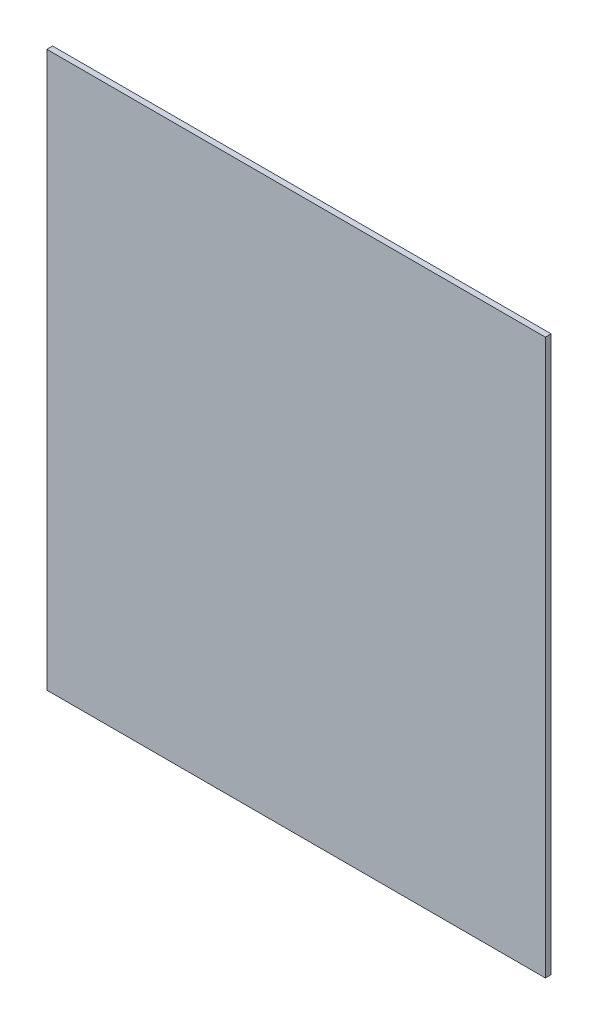
ISO-10303-21;
HEADER;
FILE_DESCRIPTION(('STEP AP214'),'2;1');
FILE_NAME('part.step','',(''),(''),'','','');
FILE_SCHEMA(('AUTOMOTIVE_DESIGN { 1 0 10303 214 1 1 1 1 }'));
ENDSEC;
DATA;
#1=APPLICATION_CONTEXT('core data for automotive mechanical design processes');
#2=APPLICATION_PROTOCOL_DEFINITION('international standard','automotive_design',2000,#1);
#3=PRODUCT_CONTEXT('',#1,'mechanical');
#4=PRODUCT('Part','Part','',(#3));
#5=PRODUCT_RELATED_PRODUCT_CATEGORY('part','',(#4));
#6=PRODUCT_DEFINITION_FORMATION('','',#4);
#7=PRODUCT_DEFINITION_CONTEXT('part definition',#1,'design');
#8=PRODUCT_DEFINITION('design','',#6,#7);
#9=PRODUCT_DEFINITION_SHAPE('','',#8);
#10=(LENGTH_UNIT() NAMED_UNIT(*) SI_UNIT(.MILLI.,.METRE.));
#11=(NAMED_UNIT(*) PLANE_ANGLE_UNIT() SI_UNIT($,.RADIAN.));
#12=(NAMED_UNIT(*) SI_UNIT($,.STERADIAN.) SOLID_ANGLE_UNIT());
#13=UNCERTAINTY_MEASURE_WITH_UNIT(LENGTH_MEASURE(1.E-05),#10,'distance_accuracy_value','');
#14=(GEOMETRIC_REPRESENTATION_CONTEXT(3) GLOBAL_UNCERTAINTY_ASSIGNED_CONTEXT((#13)) GLOBAL_UNIT_ASSIGNED_CONTEXT((#10,
#11,#12)) REPRESENTATION_CONTEXT('',''));
#15=CARTESIAN_POINT('',(0.,0.,0.));
#16=DIRECTION('',(0.,0.,1.));
#17=DIRECTION('',(1.,0.,0.));
#18=AXIS2_PLACEMENT_3D('',#15,#16,#17);
#19=CARTESIAN_POINT('',(-116.392992274228,109.571624087591,3.));
#20=DIRECTION('',(1.,0.,0.));
#21=DIRECTION('',(0.,1.,0.));
#22=AXIS2_PLACEMENT_3D('',#19,#20,#21);
#23=PLANE('',#22);
#24=DIRECTION('',(0.,-1.,0.));
#25=VECTOR('',#24,1.);
#26=CARTESIAN_POINT('',(-116.392992274228,109.571624087591,0.));
#27=LINE('',#26,#25);
#28=CARTESIAN_POINT('',(-116.392992274228,109.571624087591,0.));
#29=VERTEX_POINT('',#28);
#30=CARTESIAN_POINT('',(-116.392992274228,-180.428375912409,0.));
#31=VERTEX_POINT('',#30);
#32=EDGE_CURVE('E98',#29,#31,#27,.T.);
#33=ORIENTED_EDGE('',*,*,#32,.T.);
#34=DIRECTION('',(0.,0.,-1.));
#35=VECTOR('',#34,1.);
#36=CARTESIAN_POINT('',(-116.392992274228,-180.428375912409,3.));
#37=LINE('',#36,#35);
#38=CARTESIAN_POINT('',(-116.392992274228,-180.428375912409,3.));
#39=VERTEX_POINT('',#38);
#40=EDGE_CURVE('E11',#39,#31,#37,.T.);
#41=ORIENTED_EDGE('',*,*,#40,.F.);
#42=DIRECTION('',(0.,-1.,0.));
#43=VECTOR('',#42,1.);
#44=CARTESIAN_POINT('',(-116.392992274228,109.571624087591,3.));
#45=LINE('',#44,#43);
#46=CARTESIAN_POINT('',(-116.392992274228,109.571624087591,3.));
#47=VERTEX_POINT('',#46);
#48=EDGE_CURVE('E86',#47,#39,#45,.T.);
#49=ORIENTED_EDGE('',*,*,#48,.F.);
#50=DIRECTION('',(0.,0.,-1.));
#51=VECTOR('',#50,1.);
#52=CARTESIAN_POINT('',(-116.392992274228,109.571624087591,3.));
#53=LINE('',#52,#51);
#54=EDGE_CURVE('E94',#47,#29,#53,.T.);
#55=ORIENTED_EDGE('',*,*,#54,.T.);
#56=EDGE_LOOP('',(#33,#41,#49,#55));
#57=FACE_BOUND('',#56,.T.);
#58=ADVANCED_FACE('F35',(#57),#23,.F.);
#59=CARTESIAN_POINT('',(-116.392992274228,-180.428375912409,3.));
#60=DIRECTION('',(0.,1.,0.));
#61=DIRECTION('',(0.,0.,1.));
#62=AXIS2_PLACEMENT_3D('',#59,#60,#61);
#63=PLANE('',#62);
#64=DIRECTION('',(1.,0.,0.));
#65=VECTOR('',#64,1.);
#66=CARTESIAN_POINT('',(-116.392992274228,-180.428375912409,0.));
#67=LINE('',#66,#65);
#68=CARTESIAN_POINT('',(144.107007725772,-180.428375912409,0.));
#69=VERTEX_POINT('',#68);
#70=EDGE_CURVE('E90',#31,#69,#67,.T.);
#71=ORIENTED_EDGE('',*,*,#70,.T.);
#72=DIRECTION('',(0.,0.,-1.));
#73=VECTOR('',#72,1.);
#74=CARTESIAN_POINT('',(144.107007725772,-180.428375912409,3.));
#75=LINE('',#74,#73);
#76=CARTESIAN_POINT('',(144.107007725772,-180.428375912409,3.));
#77=VERTEX_POINT('',#76);
#78=EDGE_CURVE('E43',#77,#69,#75,.T.);
#79=ORIENTED_EDGE('',*,*,#78,.F.);
#80=DIRECTION('',(1.,0.,0.));
#81=VECTOR('',#80,1.);
#82=CARTESIAN_POINT('',(-116.392992274228,-180.428375912409,3.));
#83=LINE('',#82,#81);
#84=EDGE_CURVE('E81',#39,#77,#83,.T.);
#85=ORIENTED_EDGE('',*,*,#84,.F.);
#86=ORIENTED_EDGE('',*,*,#40,.T.);
#87=EDGE_LOOP('',(#71,#79,#85,#86));
#88=FACE_BOUND('',#87,.T.);
#89=ADVANCED_FACE('F89',(#88),#63,.F.);
#90=CARTESIAN_POINT('',(144.107007725772,109.571624087591,3.));
#91=DIRECTION('',(-1.,0.,0.));
#92=DIRECTION('',(0.,-1.,0.));
#93=AXIS2_PLACEMENT_3D('',#90,#91,#92);
#94=PLANE('',#93);
#95=DIRECTION('',(0.,1.,0.));
#96=VECTOR('',#95,1.);
#97=CARTESIAN_POINT('',(144.107007725772,109.571624087591,0.));
#98=LINE('',#97,#96);
#99=CARTESIAN_POINT('',(144.107007725772,109.571624087591,0.));
#100=VERTEX_POINT('',#99);
#101=EDGE_CURVE('E68',#69,#100,#98,.T.);
#102=ORIENTED_EDGE('',*,*,#101,.T.);
#103=DIRECTION('',(0.,0.,-1.));
#104=VECTOR('',#103,1.);
#105=CARTESIAN_POINT('',(144.107007725772,109.571624087591,3.));
#106=LINE('',#105,#104);
#107=CARTESIAN_POINT('',(144.107007725772,109.571624087591,3.));
#108=VERTEX_POINT('',#107);
#109=EDGE_CURVE('E91',#108,#100,#106,.T.);
#110=ORIENTED_EDGE('',*,*,#109,.F.);
#111=DIRECTION('',(0.,1.,0.));
#112=VECTOR('',#111,1.);
#113=CARTESIAN_POINT('',(144.107007725772,109.571624087591,3.));
#114=LINE('',#113,#112);
#115=EDGE_CURVE('E84',#77,#108,#114,.T.);
#116=ORIENTED_EDGE('',*,*,#115,.F.);
#117=ORIENTED_EDGE('',*,*,#78,.T.);
#118=EDGE_LOOP('',(#102,#110,#116,#117));
#119=FACE_BOUND('',#118,.T.);
#120=ADVANCED_FACE('F92',(#119),#94,.F.);
#121=CARTESIAN_POINT('',(-116.392992274228,109.571624087591,3.));
#122=DIRECTION('',(0.,-1.,0.));
#123=DIRECTION('',(0.,0.,-1.));
#124=AXIS2_PLACEMENT_3D('',#121,#122,#123);
#125=PLANE('',#124);
#126=DIRECTION('',(-1.,0.,0.));
#127=VECTOR('',#126,1.);
#128=CARTESIAN_POINT('',(-116.392992274228,109.571624087591,0.));
#129=LINE('',#128,#127);
#130=EDGE_CURVE('E74',#100,#29,#129,.T.);
#131=ORIENTED_EDGE('',*,*,#130,.T.);
#132=ORIENTED_EDGE('',*,*,#54,.F.);
#133=DIRECTION('',(-1.,0.,0.));
#134=VECTOR('',#133,1.);
#135=CARTESIAN_POINT('',(-116.392992274228,109.571624087591,3.));
#136=LINE('',#135,#134);
#137=EDGE_CURVE('E51',#108,#47,#136,.T.);
#138=ORIENTED_EDGE('',*,*,#137,.F.);
#139=ORIENTED_EDGE('',*,*,#109,.T.);
#140=EDGE_LOOP('',(#131,#132,#138,#139));
#141=FACE_BOUND('',#140,.T.);
#142=ADVANCED_FACE('F105',(#141),#125,.F.);
#143=CARTESIAN_POINT('',(0.,0.,3.));
#144=DIRECTION('',(0.,0.,1.));
#145=DIRECTION('',(1.,0.,0.));
#146=AXIS2_PLACEMENT_3D('',#143,#144,#145);
#147=PLANE('',#146);
#148=ORIENTED_EDGE('',*,*,#48,.T.);
#149=ORIENTED_EDGE('',*,*,#84,.T.);
#150=ORIENTED_EDGE('',*,*,#115,.T.);
#151=ORIENTED_EDGE('',*,*,#137,.T.);
#152=EDGE_LOOP('',(#148,#149,#150,#151));
#153=FACE_BOUND('',#152,.T.);
#154=ADVANCED_FACE('F82',(#153),#147,.T.);
#155=CARTESIAN_POINT('',(0.,0.,0.));
#156=DIRECTION('',(0.,0.,1.));
#157=DIRECTION('',(1.,0.,0.));
#158=AXIS2_PLACEMENT_3D('',#155,#156,#157);
#159=PLANE('',#158);
#160=ORIENTED_EDGE('',*,*,#32,.F.);
#161=ORIENTED_EDGE('',*,*,#130,.F.);
#162=ORIENTED_EDGE('',*,*,#101,.F.);
#163=ORIENTED_EDGE('',*,*,#70,.F.);
#164=EDGE_LOOP('',(#160,#161,#162,#163));
#165=FACE_BOUND('',#164,.T.);
#166=ADVANCED_FACE('F108',(#165),#159,.F.);
#167=CLOSED_SHELL('',(#58,#89,#120,#142,#154,#166));
#168=MANIFOLD_SOLID_BREP('B2',#167);
#169=ADVANCED_BREP_SHAPE_REPRESENTATION('',(#18,#168),#14);
#170=SHAPE_DEFINITION_REPRESENTATION(#9,#169);
ENDSEC;
END-ISO-10303-21;
